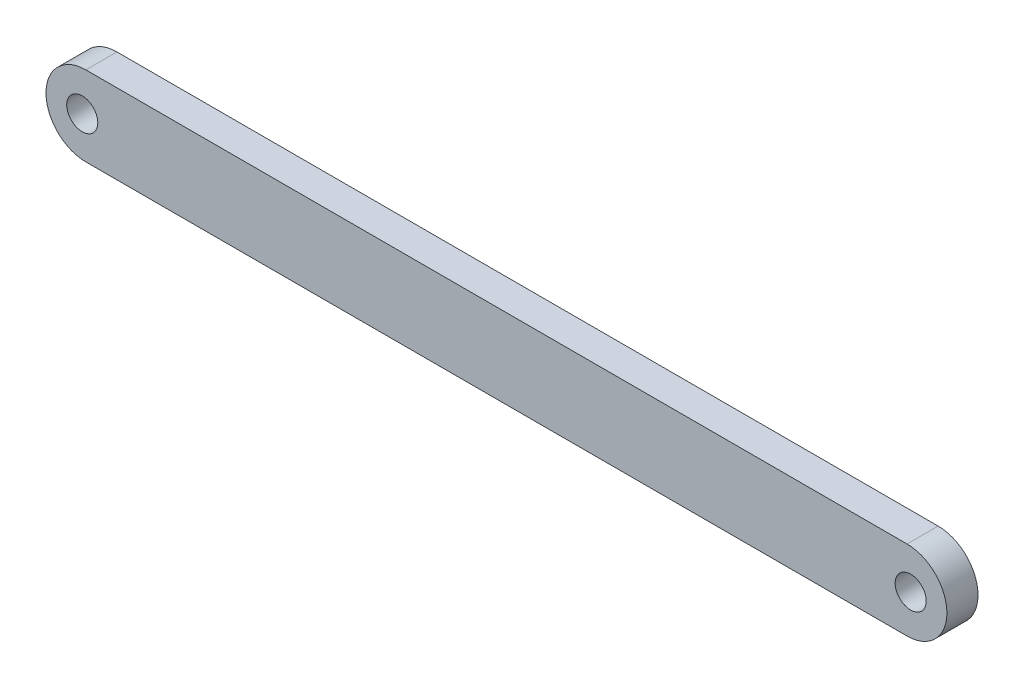
ISO-10303-21;
HEADER;
FILE_DESCRIPTION(('STEP AP214'),'2;1');
FILE_NAME('part.step','',(''),(''),'','','');
FILE_SCHEMA(('AUTOMOTIVE_DESIGN { 1 0 10303 214 1 1 1 1 }'));
ENDSEC;
DATA;
#1=APPLICATION_CONTEXT('core data for automotive mechanical design processes');
#2=APPLICATION_PROTOCOL_DEFINITION('international standard','automotive_design',2000,#1);
#3=PRODUCT_CONTEXT('',#1,'mechanical');
#4=PRODUCT('Part','Part','',(#3));
#5=PRODUCT_RELATED_PRODUCT_CATEGORY('part','',(#4));
#6=PRODUCT_DEFINITION_FORMATION('','',#4);
#7=PRODUCT_DEFINITION_CONTEXT('part definition',#1,'design');
#8=PRODUCT_DEFINITION('design','',#6,#7);
#9=PRODUCT_DEFINITION_SHAPE('','',#8);
#10=(LENGTH_UNIT() NAMED_UNIT(*) SI_UNIT(.MILLI.,.METRE.));
#11=(NAMED_UNIT(*) PLANE_ANGLE_UNIT() SI_UNIT($,.RADIAN.));
#12=(NAMED_UNIT(*) SI_UNIT($,.STERADIAN.) SOLID_ANGLE_UNIT());
#13=UNCERTAINTY_MEASURE_WITH_UNIT(LENGTH_MEASURE(1.E-05),#10,'distance_accuracy_value','');
#14=(GEOMETRIC_REPRESENTATION_CONTEXT(3) GLOBAL_UNCERTAINTY_ASSIGNED_CONTEXT((#13)) GLOBAL_UNIT_ASSIGNED_CONTEXT((#10,
#11,#12)) REPRESENTATION_CONTEXT('',''));
#15=CARTESIAN_POINT('',(0.,0.,0.));
#16=DIRECTION('',(0.,0.,1.));
#17=DIRECTION('',(1.,0.,0.));
#18=AXIS2_PLACEMENT_3D('',#15,#16,#17);
#19=CARTESIAN_POINT('',(-83.15,3.84999999999999,-3.));
#20=DIRECTION('',(0.,0.,1.));
#21=DIRECTION('',(1.,0.,0.));
#22=AXIS2_PLACEMENT_3D('',#19,#20,#21);
#23=CYLINDRICAL_SURFACE('',#22,3.85);
#24=CARTESIAN_POINT('',(-83.15,3.84999999999999,0.));
#25=DIRECTION('',(0.,0.,1.));
#26=DIRECTION('',(1.,0.,0.));
#27=AXIS2_PLACEMENT_3D('',#24,#25,#26);
#28=CIRCLE('',#27,3.85);
#29=CARTESIAN_POINT('',(-83.15,7.69999999999999,0.));
#30=VERTEX_POINT('',#29);
#31=CARTESIAN_POINT('',(-83.15,0.,0.));
#32=VERTEX_POINT('',#31);
#33=EDGE_CURVE('E101',#30,#32,#28,.T.);
#34=ORIENTED_EDGE('',*,*,#33,.F.);
#35=DIRECTION('',(0.,0.,1.));
#36=VECTOR('',#35,1.);
#37=CARTESIAN_POINT('',(-83.15,7.69999999999999,-3.));
#38=LINE('',#37,#36);
#39=CARTESIAN_POINT('',(-83.15,7.69999999999999,-3.));
#40=VERTEX_POINT('',#39);
#41=EDGE_CURVE('E11',#40,#30,#38,.T.);
#42=ORIENTED_EDGE('',*,*,#41,.F.);
#43=CARTESIAN_POINT('',(-83.15,3.84999999999999,-3.));
#44=DIRECTION('',(0.,0.,1.));
#45=DIRECTION('',(1.,0.,0.));
#46=AXIS2_PLACEMENT_3D('',#43,#44,#45);
#47=CIRCLE('',#46,3.85);
#48=CARTESIAN_POINT('',(-83.15,0.,-3.));
#49=VERTEX_POINT('',#48);
#50=EDGE_CURVE('E94',#40,#49,#47,.T.);
#51=ORIENTED_EDGE('',*,*,#50,.T.);
#52=DIRECTION('',(0.,0.,1.));
#53=VECTOR('',#52,1.);
#54=CARTESIAN_POINT('',(-83.15,0.,-3.));
#55=LINE('',#54,#53);
#56=EDGE_CURVE('E39',#49,#32,#55,.T.);
#57=ORIENTED_EDGE('',*,*,#56,.T.);
#58=EDGE_LOOP('',(#34,#42,#51,#57));
#59=FACE_BOUND('',#58,.T.);
#60=ADVANCED_FACE('F36',(#59),#23,.T.);
#61=CARTESIAN_POINT('',(-83.15,7.69999999999999,-3.));
#62=DIRECTION('',(0.,1.,0.));
#63=DIRECTION('',(0.,0.,1.));
#64=AXIS2_PLACEMENT_3D('',#61,#62,#63);
#65=PLANE('',#64);
#66=DIRECTION('',(-1.,0.,0.));
#67=VECTOR('',#66,1.);
#68=CARTESIAN_POINT('',(-83.15,7.69999999999999,0.));
#69=LINE('',#68,#67);
#70=CARTESIAN_POINT('',(-3.85000000000001,7.69999999999999,0.));
#71=VERTEX_POINT('',#70);
#72=EDGE_CURVE('E96',#71,#30,#69,.T.);
#73=ORIENTED_EDGE('',*,*,#72,.F.);
#74=DIRECTION('',(0.,0.,1.));
#75=VECTOR('',#74,1.);
#76=CARTESIAN_POINT('',(-3.85000000000001,7.69999999999999,-3.));
#77=LINE('',#76,#75);
#78=CARTESIAN_POINT('',(-3.85000000000001,7.69999999999999,-3.));
#79=VERTEX_POINT('',#78);
#80=EDGE_CURVE('E45',#79,#71,#77,.T.);
#81=ORIENTED_EDGE('',*,*,#80,.F.);
#82=DIRECTION('',(-1.,0.,0.));
#83=VECTOR('',#82,1.);
#84=CARTESIAN_POINT('',(-83.15,7.69999999999999,-3.));
#85=LINE('',#84,#83);
#86=EDGE_CURVE('E91',#79,#40,#85,.T.);
#87=ORIENTED_EDGE('',*,*,#86,.T.);
#88=ORIENTED_EDGE('',*,*,#41,.T.);
#89=EDGE_LOOP('',(#73,#81,#87,#88));
#90=FACE_BOUND('',#89,.T.);
#91=ADVANCED_FACE('F112',(#90),#65,.T.);
#92=CARTESIAN_POINT('',(-3.85,3.84999999999999,-3.));
#93=DIRECTION('',(0.,0.,1.));
#94=DIRECTION('',(1.,0.,0.));
#95=AXIS2_PLACEMENT_3D('',#92,#93,#94);
#96=CYLINDRICAL_SURFACE('',#95,3.85);
#97=CARTESIAN_POINT('',(-3.85,3.84999999999999,0.));
#98=DIRECTION('',(0.,0.,1.));
#99=DIRECTION('',(-1.,0.,0.));
#100=AXIS2_PLACEMENT_3D('',#97,#98,#99);
#101=CIRCLE('',#100,3.85);
#102=CARTESIAN_POINT('',(-3.85,0.,0.));
#103=VERTEX_POINT('',#102);
#104=EDGE_CURVE('E86',#103,#71,#101,.T.);
#105=ORIENTED_EDGE('',*,*,#104,.F.);
#106=DIRECTION('',(0.,0.,1.));
#107=VECTOR('',#106,1.);
#108=CARTESIAN_POINT('',(-3.85,0.,-3.));
#109=LINE('',#108,#107);
#110=CARTESIAN_POINT('',(-3.85,0.,-3.));
#111=VERTEX_POINT('',#110);
#112=EDGE_CURVE('E81',#111,#103,#109,.T.);
#113=ORIENTED_EDGE('',*,*,#112,.F.);
#114=CARTESIAN_POINT('',(-3.85,3.84999999999999,-3.));
#115=DIRECTION('',(0.,0.,1.));
#116=DIRECTION('',(-1.,0.,0.));
#117=AXIS2_PLACEMENT_3D('',#114,#115,#116);
#118=CIRCLE('',#117,3.85);
#119=EDGE_CURVE('E84',#111,#79,#118,.T.);
#120=ORIENTED_EDGE('',*,*,#119,.T.);
#121=ORIENTED_EDGE('',*,*,#80,.T.);
#122=EDGE_LOOP('',(#105,#113,#120,#121));
#123=FACE_BOUND('',#122,.T.);
#124=ADVANCED_FACE('F83',(#123),#96,.T.);
#125=CARTESIAN_POINT('',(-3.85000000000001,0.,-3.));
#126=DIRECTION('',(0.,-1.,0.));
#127=DIRECTION('',(0.,0.,-1.));
#128=AXIS2_PLACEMENT_3D('',#125,#126,#127);
#129=PLANE('',#128);
#130=DIRECTION('',(1.,0.,0.));
#131=VECTOR('',#130,1.);
#132=CARTESIAN_POINT('',(-3.85000000000001,0.,0.));
#133=LINE('',#132,#131);
#134=EDGE_CURVE('E104',#32,#103,#133,.T.);
#135=ORIENTED_EDGE('',*,*,#134,.F.);
#136=ORIENTED_EDGE('',*,*,#56,.F.);
#137=DIRECTION('',(1.,0.,0.));
#138=VECTOR('',#137,1.);
#139=CARTESIAN_POINT('',(-3.85000000000001,0.,-3.));
#140=LINE('',#139,#138);
#141=EDGE_CURVE('E90',#49,#111,#140,.T.);
#142=ORIENTED_EDGE('',*,*,#141,.T.);
#143=ORIENTED_EDGE('',*,*,#112,.T.);
#144=EDGE_LOOP('',(#135,#136,#142,#143));
#145=FACE_BOUND('',#144,.T.);
#146=ADVANCED_FACE('F93',(#145),#129,.T.);
#147=CARTESIAN_POINT('',(-83.15,3.84999999999999,-3.));
#148=DIRECTION('',(0.,0.,1.));
#149=DIRECTION('',(1.,0.,0.));
#150=AXIS2_PLACEMENT_3D('',#147,#148,#149);
#151=PLANE('',#150);
#152=CARTESIAN_POINT('',(-83.5,3.84999999999999,-3.));
#153=DIRECTION('',(0.,0.,1.));
#154=DIRECTION('',(1.,0.,0.));
#155=AXIS2_PLACEMENT_3D('',#152,#153,#154);
#156=CIRCLE('',#155,1.5);
#157=CARTESIAN_POINT('',(-82.,3.84999999999999,-3.));
#158=VERTEX_POINT('',#157);
#159=EDGE_CURVE('E145',#158,#158,#156,.T.);
#160=ORIENTED_EDGE('',*,*,#159,.T.);
#161=EDGE_LOOP('',(#160));
#162=FACE_BOUND('',#161,.T.);
#163=CARTESIAN_POINT('',(-3.5,3.84999999999999,-3.));
#164=DIRECTION('',(0.,0.,1.));
#165=DIRECTION('',(1.,0.,0.));
#166=AXIS2_PLACEMENT_3D('',#163,#164,#165);
#167=CIRCLE('',#166,1.5);
#168=CARTESIAN_POINT('',(-2.,3.84999999999999,-3.));
#169=VERTEX_POINT('',#168);
#170=EDGE_CURVE('E105',#169,#169,#167,.T.);
#171=ORIENTED_EDGE('',*,*,#170,.T.);
#172=EDGE_LOOP('',(#171));
#173=FACE_BOUND('',#172,.T.);
#174=ORIENTED_EDGE('',*,*,#50,.F.);
#175=ORIENTED_EDGE('',*,*,#86,.F.);
#176=ORIENTED_EDGE('',*,*,#119,.F.);
#177=ORIENTED_EDGE('',*,*,#141,.F.);
#178=EDGE_LOOP('',(#174,#175,#176,#177));
#179=FACE_BOUND('',#178,.T.);
#180=ADVANCED_FACE('F89',(#162,#173,#179),#151,.F.);
#181=CARTESIAN_POINT('',(-83.15,3.84999999999999,0.));
#182=DIRECTION('',(0.,0.,1.));
#183=DIRECTION('',(1.,0.,0.));
#184=AXIS2_PLACEMENT_3D('',#181,#182,#183);
#185=PLANE('',#184);
#186=CARTESIAN_POINT('',(-83.5,3.84999999999999,0.));
#187=DIRECTION('',(0.,0.,1.));
#188=DIRECTION('',(1.,0.,0.));
#189=AXIS2_PLACEMENT_3D('',#186,#187,#188);
#190=CIRCLE('',#189,1.5);
#191=CARTESIAN_POINT('',(-82.,3.84999999999999,0.));
#192=VERTEX_POINT('',#191);
#193=EDGE_CURVE('E148',#192,#192,#190,.T.);
#194=ORIENTED_EDGE('',*,*,#193,.F.);
#195=EDGE_LOOP('',(#194));
#196=FACE_BOUND('',#195,.T.);
#197=CARTESIAN_POINT('',(-3.5,3.84999999999999,0.));
#198=DIRECTION('',(0.,0.,1.));
#199=DIRECTION('',(1.,0.,0.));
#200=AXIS2_PLACEMENT_3D('',#197,#198,#199);
#201=CIRCLE('',#200,1.5);
#202=CARTESIAN_POINT('',(-2.,3.84999999999999,0.));
#203=VERTEX_POINT('',#202);
#204=EDGE_CURVE('E150',#203,#203,#201,.T.);
#205=ORIENTED_EDGE('',*,*,#204,.F.);
#206=EDGE_LOOP('',(#205));
#207=FACE_BOUND('',#206,.T.);
#208=ORIENTED_EDGE('',*,*,#33,.T.);
#209=ORIENTED_EDGE('',*,*,#134,.T.);
#210=ORIENTED_EDGE('',*,*,#104,.T.);
#211=ORIENTED_EDGE('',*,*,#72,.T.);
#212=EDGE_LOOP('',(#208,#209,#210,#211));
#213=FACE_BOUND('',#212,.T.);
#214=ADVANCED_FACE('F111',(#196,#207,#213),#185,.T.);
#215=CARTESIAN_POINT('',(-3.5,3.84999999999999,-3.));
#216=DIRECTION('',(0.,0.,1.));
#217=DIRECTION('',(1.,0.,0.));
#218=AXIS2_PLACEMENT_3D('',#215,#216,#217);
#219=CYLINDRICAL_SURFACE('',#218,1.5);
#220=ORIENTED_EDGE('',*,*,#170,.F.);
#221=EDGE_LOOP('',(#220));
#222=FACE_BOUND('',#221,.T.);
#223=ORIENTED_EDGE('',*,*,#204,.T.);
#224=EDGE_LOOP('',(#223));
#225=FACE_BOUND('',#224,.T.);
#226=ADVANCED_FACE('F130',(#222,#225),#219,.F.);
#227=CARTESIAN_POINT('',(-83.5,3.84999999999999,-3.));
#228=DIRECTION('',(0.,0.,1.));
#229=DIRECTION('',(1.,0.,0.));
#230=AXIS2_PLACEMENT_3D('',#227,#228,#229);
#231=CYLINDRICAL_SURFACE('',#230,1.5);
#232=ORIENTED_EDGE('',*,*,#159,.F.);
#233=EDGE_LOOP('',(#232));
#234=FACE_BOUND('',#233,.T.);
#235=ORIENTED_EDGE('',*,*,#193,.T.);
#236=EDGE_LOOP('',(#235));
#237=FACE_BOUND('',#236,.T.);
#238=ADVANCED_FACE('F137',(#234,#237),#231,.F.);
#239=CLOSED_SHELL('',(#60,#91,#124,#146,#180,#214,#226,#238));
#240=MANIFOLD_SOLID_BREP('B2',#239);
#241=ADVANCED_BREP_SHAPE_REPRESENTATION('',(#18,#240),#14);
#242=SHAPE_DEFINITION_REPRESENTATION(#9,#241);
ENDSEC;
END-ISO-10303-21;
